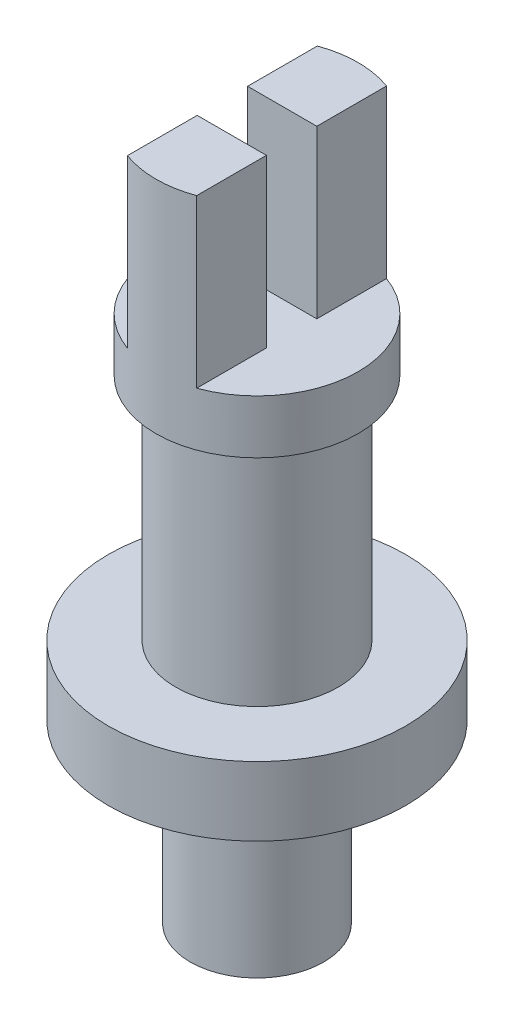
ISO-10303-21;
HEADER;
FILE_DESCRIPTION(('STEP AP214'),'2;1');
FILE_NAME('part.step','',(''),(''),'','','');
FILE_SCHEMA(('AUTOMOTIVE_DESIGN { 1 0 10303 214 1 1 1 1 }'));
ENDSEC;
DATA;
#1=APPLICATION_CONTEXT('core data for automotive mechanical design processes');
#2=APPLICATION_PROTOCOL_DEFINITION('international standard','automotive_design',2000,#1);
#3=PRODUCT_CONTEXT('',#1,'mechanical');
#4=PRODUCT('Part','Part','',(#3));
#5=PRODUCT_RELATED_PRODUCT_CATEGORY('part','',(#4));
#6=PRODUCT_DEFINITION_FORMATION('','',#4);
#7=PRODUCT_DEFINITION_CONTEXT('part definition',#1,'design');
#8=PRODUCT_DEFINITION('design','',#6,#7);
#9=PRODUCT_DEFINITION_SHAPE('','',#8);
#10=(LENGTH_UNIT() NAMED_UNIT(*) SI_UNIT(.MILLI.,.METRE.));
#11=(NAMED_UNIT(*) PLANE_ANGLE_UNIT() SI_UNIT($,.RADIAN.));
#12=(NAMED_UNIT(*) SI_UNIT($,.STERADIAN.) SOLID_ANGLE_UNIT());
#13=UNCERTAINTY_MEASURE_WITH_UNIT(LENGTH_MEASURE(1.E-05),#10,'distance_accuracy_value','');
#14=(GEOMETRIC_REPRESENTATION_CONTEXT(3) GLOBAL_UNCERTAINTY_ASSIGNED_CONTEXT((#13)) GLOBAL_UNIT_ASSIGNED_CONTEXT((#10,
#11,#12)) REPRESENTATION_CONTEXT('',''));
#15=CARTESIAN_POINT('',(0.,0.,0.));
#16=DIRECTION('',(0.,0.,1.));
#17=DIRECTION('',(1.,0.,0.));
#18=AXIS2_PLACEMENT_3D('',#15,#16,#17);
#19=CARTESIAN_POINT('',(0.,12.65,-2.42319096638346));
#20=DIRECTION('',(0.,-1.,0.));
#21=DIRECTION('',(0.,0.,-1.));
#22=AXIS2_PLACEMENT_3D('',#19,#20,#21);
#23=PLANE('',#22);
#24=DIRECTION('',(0.,0.,1.));
#25=VECTOR('',#24,1.);
#26=CARTESIAN_POINT('',(-0.829942500393144,12.65,0.));
#27=LINE('',#26,#25);
#28=CARTESIAN_POINT('',(-0.829942500393144,12.65,-2.27663126254639));
#29=VERTEX_POINT('',#28);
#30=CARTESIAN_POINT('',(-0.829942500393144,12.65,-0.604313944154779));
#31=VERTEX_POINT('',#30);
#32=EDGE_CURVE('E121',#29,#31,#27,.T.);
#33=ORIENTED_EDGE('',*,*,#32,.T.);
#34=DIRECTION('',(-1.,0.,0.));
#35=VECTOR('',#34,1.);
#36=CARTESIAN_POINT('',(1.2998695093939,12.65,-0.604313944154779));
#37=LINE('',#36,#35);
#38=CARTESIAN_POINT('',(0.829942500393144,12.65,-0.604313944154779));
#39=VERTEX_POINT('',#38);
#40=EDGE_CURVE('E115',#39,#31,#37,.T.);
#41=ORIENTED_EDGE('',*,*,#40,.F.);
#42=DIRECTION('',(0.,0.,1.));
#43=VECTOR('',#42,1.);
#44=CARTESIAN_POINT('',(0.829942500393144,12.65,0.));
#45=LINE('',#44,#43);
#46=CARTESIAN_POINT('',(0.829942500393144,12.65,-2.27663126254639));
#47=VERTEX_POINT('',#46);
#48=EDGE_CURVE('E140',#47,#39,#45,.T.);
#49=ORIENTED_EDGE('',*,*,#48,.F.);
#50=CARTESIAN_POINT('',(0.,12.65,0.));
#51=DIRECTION('',(0.,1.,0.));
#52=DIRECTION('',(0.,0.,1.));
#53=AXIS2_PLACEMENT_3D('',#50,#51,#52);
#54=CIRCLE('',#53,2.42319096638346);
#55=EDGE_CURVE('E151',#47,#29,#54,.T.);
#56=ORIENTED_EDGE('',*,*,#55,.T.);
#57=EDGE_LOOP('',(#33,#41,#49,#56));
#58=FACE_BOUND('',#57,.T.);
#59=ADVANCED_FACE('F33',(#58),#23,.F.);
#60=CARTESIAN_POINT('',(0.829942500393144,8.65,0.));
#61=DIRECTION('',(-1.,0.,0.));
#62=DIRECTION('',(0.,0.,1.));
#63=AXIS2_PLACEMENT_3D('',#60,#61,#62);
#64=PLANE('',#63);
#65=ORIENTED_EDGE('',*,*,#48,.T.);
#66=DIRECTION('',(0.,-1.,0.));
#67=VECTOR('',#66,1.);
#68=CARTESIAN_POINT('',(0.829942500393144,8.65,-0.604313944154779));
#69=LINE('',#68,#67);
#70=CARTESIAN_POINT('',(0.829942500393144,8.65,-0.604313944154779));
#71=VERTEX_POINT('',#70);
#72=EDGE_CURVE('E122',#39,#71,#69,.T.);
#73=ORIENTED_EDGE('',*,*,#72,.T.);
#74=DIRECTION('',(0.,0.,1.));
#75=VECTOR('',#74,1.);
#76=CARTESIAN_POINT('',(0.829942500393144,8.65,0.));
#77=LINE('',#76,#75);
#78=CARTESIAN_POINT('',(0.829942500393144,8.65,-2.27663126254639));
#79=VERTEX_POINT('',#78);
#80=EDGE_CURVE('E141',#79,#71,#77,.T.);
#81=ORIENTED_EDGE('',*,*,#80,.F.);
#82=DIRECTION('',(0.,1.,0.));
#83=VECTOR('',#82,1.);
#84=CARTESIAN_POINT('',(0.829942500393144,8.65,-2.27663126254639));
#85=LINE('',#84,#83);
#86=EDGE_CURVE('E143',#79,#47,#85,.T.);
#87=ORIENTED_EDGE('',*,*,#86,.T.);
#88=EDGE_LOOP('',(#65,#73,#81,#87));
#89=FACE_BOUND('',#88,.T.);
#90=ADVANCED_FACE('F191',(#89),#64,.F.);
#91=CARTESIAN_POINT('',(-0.829942500393144,8.65,0.));
#92=DIRECTION('',(-1.,0.,0.));
#93=DIRECTION('',(0.,0.,1.));
#94=AXIS2_PLACEMENT_3D('',#91,#92,#93);
#95=PLANE('',#94);
#96=DIRECTION('',(0.,-1.,0.));
#97=VECTOR('',#96,1.);
#98=CARTESIAN_POINT('',(-0.829942500393144,8.65,-0.604313944154779));
#99=LINE('',#98,#97);
#100=CARTESIAN_POINT('',(-0.829942500393144,8.65,-0.604313944154779));
#101=VERTEX_POINT('',#100);
#102=EDGE_CURVE('E127',#31,#101,#99,.T.);
#103=ORIENTED_EDGE('',*,*,#102,.F.);
#104=ORIENTED_EDGE('',*,*,#32,.F.);
#105=DIRECTION('',(0.,1.,0.));
#106=VECTOR('',#105,1.);
#107=CARTESIAN_POINT('',(-0.829942500393144,8.65,-2.27663126254639));
#108=LINE('',#107,#106);
#109=CARTESIAN_POINT('',(-0.829942500393144,8.65,-2.27663126254639));
#110=VERTEX_POINT('',#109);
#111=EDGE_CURVE('E134',#110,#29,#108,.T.);
#112=ORIENTED_EDGE('',*,*,#111,.F.);
#113=DIRECTION('',(0.,0.,1.));
#114=VECTOR('',#113,1.);
#115=CARTESIAN_POINT('',(-0.829942500393144,8.65,0.));
#116=LINE('',#115,#114);
#117=EDGE_CURVE('E53',#110,#101,#116,.T.);
#118=ORIENTED_EDGE('',*,*,#117,.T.);
#119=EDGE_LOOP('',(#103,#104,#112,#118));
#120=FACE_BOUND('',#119,.T.);
#121=ADVANCED_FACE('F196',(#120),#95,.T.);
#122=CARTESIAN_POINT('',(0.829942500393144,12.65,0.604313944154779));
#123=VERTEX_POINT('',#122);
#124=CARTESIAN_POINT('',(0.829942500393144,12.65,2.27663126254639));
#125=VERTEX_POINT('',#124);
#126=EDGE_CURVE('E114',#123,#125,#45,.T.);
#127=ORIENTED_EDGE('',*,*,#126,.F.);
#128=DIRECTION('',(1.,0.,0.));
#129=VECTOR('',#128,1.);
#130=CARTESIAN_POINT('',(1.2998695093939,12.65,0.604313944154779));
#131=LINE('',#130,#129);
#132=CARTESIAN_POINT('',(-0.829942500393144,12.65,0.604313944154779));
#133=VERTEX_POINT('',#132);
#134=EDGE_CURVE('E100',#133,#123,#131,.T.);
#135=ORIENTED_EDGE('',*,*,#134,.F.);
#136=CARTESIAN_POINT('',(-0.829942500393144,12.65,2.27663126254639));
#137=VERTEX_POINT('',#136);
#138=EDGE_CURVE('E112',#133,#137,#27,.T.);
#139=ORIENTED_EDGE('',*,*,#138,.T.);
#140=EDGE_CURVE('E149',#137,#125,#54,.T.);
#141=ORIENTED_EDGE('',*,*,#140,.T.);
#142=EDGE_LOOP('',(#127,#135,#139,#141));
#143=FACE_BOUND('',#142,.T.);
#144=ADVANCED_FACE('F35',(#143),#23,.F.);
#145=CARTESIAN_POINT('',(0.,12.65,0.));
#146=DIRECTION('',(0.,1.,0.));
#147=DIRECTION('',(0.,0.,1.));
#148=AXIS2_PLACEMENT_3D('',#145,#146,#147);
#149=CYLINDRICAL_SURFACE('',#148,2.42319096638346);
#150=CARTESIAN_POINT('',(0.,7.36385300054283,0.));
#151=DIRECTION('',(0.,1.,0.));
#152=DIRECTION('',(0.,0.,1.));
#153=AXIS2_PLACEMENT_3D('',#150,#151,#152);
#154=CIRCLE('',#153,2.42319096638346);
#155=CARTESIAN_POINT('',(0.,7.36385300054283,2.42319096638346));
#156=VERTEX_POINT('',#155);
#157=EDGE_CURVE('E154',#156,#156,#154,.T.);
#158=ORIENTED_EDGE('',*,*,#157,.T.);
#159=EDGE_LOOP('',(#158));
#160=FACE_BOUND('',#159,.T.);
#161=DIRECTION('',(0.,1.,0.));
#162=VECTOR('',#161,1.);
#163=CARTESIAN_POINT('',(-0.829942500393144,8.65,2.27663126254639));
#164=LINE('',#163,#162);
#165=CARTESIAN_POINT('',(-0.829942500393144,8.65,2.27663126254639));
#166=VERTEX_POINT('',#165);
#167=EDGE_CURVE('E119',#166,#137,#164,.T.);
#168=ORIENTED_EDGE('',*,*,#167,.F.);
#169=CARTESIAN_POINT('',(0.,8.65,0.));
#170=DIRECTION('',(0.,1.,0.));
#171=DIRECTION('',(0.,0.,1.));
#172=AXIS2_PLACEMENT_3D('',#169,#170,#171);
#173=CIRCLE('',#172,2.42319096638346);
#174=EDGE_CURVE('E131',#110,#166,#173,.T.);
#175=ORIENTED_EDGE('',*,*,#174,.F.);
#176=ORIENTED_EDGE('',*,*,#111,.T.);
#177=ORIENTED_EDGE('',*,*,#55,.F.);
#178=ORIENTED_EDGE('',*,*,#86,.F.);
#179=CARTESIAN_POINT('',(0.,8.65,0.));
#180=DIRECTION('',(0.,1.,0.));
#181=DIRECTION('',(0.,0.,1.));
#182=AXIS2_PLACEMENT_3D('',#179,#180,#181);
#183=CIRCLE('',#182,2.42319096638346);
#184=CARTESIAN_POINT('',(0.829942500393144,8.65,2.27663126254639));
#185=VERTEX_POINT('',#184);
#186=EDGE_CURVE('E137',#185,#79,#183,.T.);
#187=ORIENTED_EDGE('',*,*,#186,.F.);
#188=DIRECTION('',(0.,1.,0.));
#189=VECTOR('',#188,1.);
#190=CARTESIAN_POINT('',(0.829942500393144,8.65,2.27663126254639));
#191=LINE('',#190,#189);
#192=EDGE_CURVE('E146',#185,#125,#191,.T.);
#193=ORIENTED_EDGE('',*,*,#192,.T.);
#194=ORIENTED_EDGE('',*,*,#140,.F.);
#195=EDGE_LOOP('',(#168,#175,#176,#177,#178,#187,#193,#194));
#196=FACE_BOUND('',#195,.T.);
#197=ADVANCED_FACE('F184',(#160,#196),#149,.T.);
#198=CARTESIAN_POINT('',(0.,-4.02,0.));
#199=DIRECTION('',(0.,1.,0.));
#200=DIRECTION('',(0.,0.,1.));
#201=AXIS2_PLACEMENT_3D('',#198,#199,#200);
#202=PLANE('',#201);
#203=CARTESIAN_POINT('',(0.,-4.02,0.));
#204=DIRECTION('',(0.,1.,0.));
#205=DIRECTION('',(0.,0.,1.));
#206=AXIS2_PLACEMENT_3D('',#203,#204,#205);
#207=CIRCLE('',#206,1.6);
#208=CARTESIAN_POINT('',(0.,-4.02,1.6));
#209=VERTEX_POINT('',#208);
#210=EDGE_CURVE('E11',#209,#209,#207,.T.);
#211=ORIENTED_EDGE('',*,*,#210,.F.);
#212=EDGE_LOOP('',(#211));
#213=FACE_BOUND('',#212,.T.);
#214=ADVANCED_FACE('F179',(#213),#202,.F.);
#215=CARTESIAN_POINT('',(0.,12.65,0.));
#216=DIRECTION('',(0.,1.,0.));
#217=DIRECTION('',(0.,0.,1.));
#218=AXIS2_PLACEMENT_3D('',#215,#216,#217);
#219=CYLINDRICAL_SURFACE('',#218,1.6);
#220=CARTESIAN_POINT('',(0.,0.,0.));
#221=DIRECTION('',(0.,1.,0.));
#222=DIRECTION('',(0.,0.,1.));
#223=AXIS2_PLACEMENT_3D('',#220,#221,#222);
#224=CIRCLE('',#223,1.6);
#225=CARTESIAN_POINT('',(0.,0.,1.6));
#226=VERTEX_POINT('',#225);
#227=EDGE_CURVE('E41',#226,#226,#224,.T.);
#228=ORIENTED_EDGE('',*,*,#227,.F.);
#229=EDGE_LOOP('',(#228));
#230=FACE_BOUND('',#229,.T.);
#231=ORIENTED_EDGE('',*,*,#210,.T.);
#232=EDGE_LOOP('',(#231));
#233=FACE_BOUND('',#232,.T.);
#234=ADVANCED_FACE('F176',(#230,#233),#219,.T.);
#235=CARTESIAN_POINT('',(0.,0.,-1.6));
#236=DIRECTION('',(0.,1.,0.));
#237=DIRECTION('',(0.,0.,1.));
#238=AXIS2_PLACEMENT_3D('',#235,#236,#237);
#239=PLANE('',#238);
#240=CARTESIAN_POINT('',(0.,0.,0.));
#241=DIRECTION('',(0.,1.,0.));
#242=DIRECTION('',(0.,0.,1.));
#243=AXIS2_PLACEMENT_3D('',#240,#241,#242);
#244=CIRCLE('',#243,1.95);
#245=CARTESIAN_POINT('',(0.,0.,1.95));
#246=VERTEX_POINT('',#245);
#247=EDGE_CURVE('E169',#246,#246,#244,.T.);
#248=ORIENTED_EDGE('',*,*,#247,.F.);
#249=EDGE_LOOP('',(#248));
#250=FACE_BOUND('',#249,.T.);
#251=ORIENTED_EDGE('',*,*,#227,.T.);
#252=EDGE_LOOP('',(#251));
#253=FACE_BOUND('',#252,.T.);
#254=ADVANCED_FACE('F174',(#250,#253),#239,.F.);
#255=CARTESIAN_POINT('',(0.,0.,0.));
#256=DIRECTION('',(0.,1.,0.));
#257=DIRECTION('',(0.,0.,1.));
#258=AXIS2_PLACEMENT_3D('',#255,#256,#257);
#259=CONICAL_SURFACE('',#258,1.95,1.44123555778938);
#260=CARTESIAN_POINT('',(0.,0.21035215784888,0.));
#261=DIRECTION('',(0.,1.,0.));
#262=DIRECTION('',(0.,0.,1.));
#263=AXIS2_PLACEMENT_3D('',#260,#261,#262);
#264=CIRCLE('',#263,3.5644844637411);
#265=CARTESIAN_POINT('',(0.,0.21035215784888,3.5644844637411));
#266=VERTEX_POINT('',#265);
#267=EDGE_CURVE('E166',#266,#266,#264,.T.);
#268=ORIENTED_EDGE('',*,*,#267,.F.);
#269=EDGE_LOOP('',(#268));
#270=FACE_BOUND('',#269,.T.);
#271=ORIENTED_EDGE('',*,*,#247,.T.);
#272=EDGE_LOOP('',(#271));
#273=FACE_BOUND('',#272,.T.);
#274=ADVANCED_FACE('F240',(#270,#273),#259,.T.);
#275=CARTESIAN_POINT('',(0.,12.65,0.));
#276=DIRECTION('',(0.,1.,0.));
#277=DIRECTION('',(0.,0.,1.));
#278=AXIS2_PLACEMENT_3D('',#275,#276,#277);
#279=CYLINDRICAL_SURFACE('',#278,3.5644844637411);
#280=CARTESIAN_POINT('',(0.,1.86385300054283,0.));
#281=DIRECTION('',(0.,1.,0.));
#282=DIRECTION('',(0.,0.,1.));
#283=AXIS2_PLACEMENT_3D('',#280,#281,#282);
#284=CIRCLE('',#283,3.5644844637411);
#285=CARTESIAN_POINT('',(0.,1.86385300054283,3.5644844637411));
#286=VERTEX_POINT('',#285);
#287=EDGE_CURVE('E163',#286,#286,#284,.T.);
#288=ORIENTED_EDGE('',*,*,#287,.F.);
#289=EDGE_LOOP('',(#288));
#290=FACE_BOUND('',#289,.T.);
#291=ORIENTED_EDGE('',*,*,#267,.T.);
#292=EDGE_LOOP('',(#291));
#293=FACE_BOUND('',#292,.T.);
#294=ADVANCED_FACE('F236',(#290,#293),#279,.T.);
#295=CARTESIAN_POINT('',(0.,1.86385300054283,-3.5644844637411));
#296=DIRECTION('',(0.,-1.,0.));
#297=DIRECTION('',(0.,0.,-1.));
#298=AXIS2_PLACEMENT_3D('',#295,#296,#297);
#299=PLANE('',#298);
#300=CARTESIAN_POINT('',(0.,1.86385300054283,0.));
#301=DIRECTION('',(0.,1.,0.));
#302=DIRECTION('',(0.,0.,1.));
#303=AXIS2_PLACEMENT_3D('',#300,#301,#302);
#304=CIRCLE('',#303,1.95);
#305=CARTESIAN_POINT('',(0.,1.86385300054283,1.95));
#306=VERTEX_POINT('',#305);
#307=EDGE_CURVE('E160',#306,#306,#304,.T.);
#308=ORIENTED_EDGE('',*,*,#307,.F.);
#309=EDGE_LOOP('',(#308));
#310=FACE_BOUND('',#309,.T.);
#311=ORIENTED_EDGE('',*,*,#287,.T.);
#312=EDGE_LOOP('',(#311));
#313=FACE_BOUND('',#312,.T.);
#314=ADVANCED_FACE('F232',(#310,#313),#299,.F.);
#315=CARTESIAN_POINT('',(0.,12.65,0.));
#316=DIRECTION('',(0.,1.,0.));
#317=DIRECTION('',(0.,0.,1.));
#318=AXIS2_PLACEMENT_3D('',#315,#316,#317);
#319=CYLINDRICAL_SURFACE('',#318,1.95);
#320=CARTESIAN_POINT('',(0.,7.36385300054283,0.));
#321=DIRECTION('',(0.,1.,0.));
#322=DIRECTION('',(0.,0.,1.));
#323=AXIS2_PLACEMENT_3D('',#320,#321,#322);
#324=CIRCLE('',#323,1.95);
#325=CARTESIAN_POINT('',(0.,7.36385300054283,1.95));
#326=VERTEX_POINT('',#325);
#327=EDGE_CURVE('E157',#326,#326,#324,.T.);
#328=ORIENTED_EDGE('',*,*,#327,.F.);
#329=EDGE_LOOP('',(#328));
#330=FACE_BOUND('',#329,.T.);
#331=ORIENTED_EDGE('',*,*,#307,.T.);
#332=EDGE_LOOP('',(#331));
#333=FACE_BOUND('',#332,.T.);
#334=ADVANCED_FACE('F228',(#330,#333),#319,.T.);
#335=CARTESIAN_POINT('',(0.,7.36385300054283,-1.95));
#336=DIRECTION('',(0.,1.,0.));
#337=DIRECTION('',(0.,0.,1.));
#338=AXIS2_PLACEMENT_3D('',#335,#336,#337);
#339=PLANE('',#338);
#340=ORIENTED_EDGE('',*,*,#157,.F.);
#341=EDGE_LOOP('',(#340));
#342=FACE_BOUND('',#341,.T.);
#343=ORIENTED_EDGE('',*,*,#327,.T.);
#344=EDGE_LOOP('',(#343));
#345=FACE_BOUND('',#344,.T.);
#346=ADVANCED_FACE('F223',(#342,#345),#339,.F.);
#347=CARTESIAN_POINT('',(0.829942500393144,8.65,0.604313944154779));
#348=VERTEX_POINT('',#347);
#349=EDGE_CURVE('E139',#348,#185,#77,.T.);
#350=ORIENTED_EDGE('',*,*,#349,.F.);
#351=DIRECTION('',(0.,1.,0.));
#352=VECTOR('',#351,1.);
#353=CARTESIAN_POINT('',(0.829942500393144,8.65,0.604313944154779));
#354=LINE('',#353,#352);
#355=EDGE_CURVE('E107',#348,#123,#354,.T.);
#356=ORIENTED_EDGE('',*,*,#355,.T.);
#357=ORIENTED_EDGE('',*,*,#126,.T.);
#358=ORIENTED_EDGE('',*,*,#192,.F.);
#359=EDGE_LOOP('',(#350,#356,#357,#358));
#360=FACE_BOUND('',#359,.T.);
#361=ADVANCED_FACE('F199',(#360),#64,.F.);
#362=CARTESIAN_POINT('',(0.,8.65,0.));
#363=DIRECTION('',(0.,1.,0.));
#364=DIRECTION('',(0.,0.,1.));
#365=AXIS2_PLACEMENT_3D('',#362,#363,#364);
#366=PLANE('',#365);
#367=ORIENTED_EDGE('',*,*,#80,.T.);
#368=DIRECTION('',(-1.,0.,0.));
#369=VECTOR('',#368,1.);
#370=CARTESIAN_POINT('',(1.2998695093939,8.65,-0.604313944154779));
#371=LINE('',#370,#369);
#372=EDGE_CURVE('E48',#71,#101,#371,.T.);
#373=ORIENTED_EDGE('',*,*,#372,.T.);
#374=ORIENTED_EDGE('',*,*,#117,.F.);
#375=ORIENTED_EDGE('',*,*,#174,.T.);
#376=CARTESIAN_POINT('',(-0.829942500393144,8.65,0.604313944154779));
#377=VERTEX_POINT('',#376);
#378=EDGE_CURVE('E125',#377,#166,#116,.T.);
#379=ORIENTED_EDGE('',*,*,#378,.F.);
#380=DIRECTION('',(1.,0.,0.));
#381=VECTOR('',#380,1.);
#382=CARTESIAN_POINT('',(1.2998695093939,8.65,0.604313944154779));
#383=LINE('',#382,#381);
#384=EDGE_CURVE('E103',#377,#348,#383,.T.);
#385=ORIENTED_EDGE('',*,*,#384,.T.);
#386=ORIENTED_EDGE('',*,*,#349,.T.);
#387=ORIENTED_EDGE('',*,*,#186,.T.);
#388=EDGE_LOOP('',(#367,#373,#374,#375,#379,#385,#386,#387));
#389=FACE_BOUND('',#388,.T.);
#390=ADVANCED_FACE('F213',(#389),#366,.T.);
#391=DIRECTION('',(0.,1.,0.));
#392=VECTOR('',#391,1.);
#393=CARTESIAN_POINT('',(-0.829942500393144,8.65,0.604313944154779));
#394=LINE('',#393,#392);
#395=EDGE_CURVE('E97',#377,#133,#394,.T.);
#396=ORIENTED_EDGE('',*,*,#395,.F.);
#397=ORIENTED_EDGE('',*,*,#378,.T.);
#398=ORIENTED_EDGE('',*,*,#167,.T.);
#399=ORIENTED_EDGE('',*,*,#138,.F.);
#400=EDGE_LOOP('',(#396,#397,#398,#399));
#401=FACE_BOUND('',#400,.T.);
#402=ADVANCED_FACE('F117',(#401),#95,.T.);
#403=CARTESIAN_POINT('',(1.2998695093939,8.65,-0.604313944154779));
#404=DIRECTION('',(0.,0.,-1.));
#405=DIRECTION('',(-1.,0.,0.));
#406=AXIS2_PLACEMENT_3D('',#403,#404,#405);
#407=PLANE('',#406);
#408=ORIENTED_EDGE('',*,*,#40,.T.);
#409=ORIENTED_EDGE('',*,*,#102,.T.);
#410=ORIENTED_EDGE('',*,*,#372,.F.);
#411=ORIENTED_EDGE('',*,*,#72,.F.);
#412=EDGE_LOOP('',(#408,#409,#410,#411));
#413=FACE_BOUND('',#412,.T.);
#414=ADVANCED_FACE('F212',(#413),#407,.F.);
#415=CARTESIAN_POINT('',(1.2998695093939,8.65,0.604313944154779));
#416=DIRECTION('',(0.,0.,1.));
#417=DIRECTION('',(1.,0.,0.));
#418=AXIS2_PLACEMENT_3D('',#415,#416,#417);
#419=PLANE('',#418);
#420=ORIENTED_EDGE('',*,*,#384,.F.);
#421=ORIENTED_EDGE('',*,*,#395,.T.);
#422=ORIENTED_EDGE('',*,*,#134,.T.);
#423=ORIENTED_EDGE('',*,*,#355,.F.);
#424=EDGE_LOOP('',(#420,#421,#422,#423));
#425=FACE_BOUND('',#424,.T.);
#426=ADVANCED_FACE('F99',(#425),#419,.F.);
#427=CLOSED_SHELL('',(#59,#90,#121,#144,#197,#214,#234,#254,#274,#294,#314,#334,#346,#361,#390,
#402,#414,#426));
#428=MANIFOLD_SOLID_BREP('B2',#427);
#429=ADVANCED_BREP_SHAPE_REPRESENTATION('',(#18,#428),#14);
#430=SHAPE_DEFINITION_REPRESENTATION(#9,#429);
ENDSEC;
END-ISO-10303-21;
